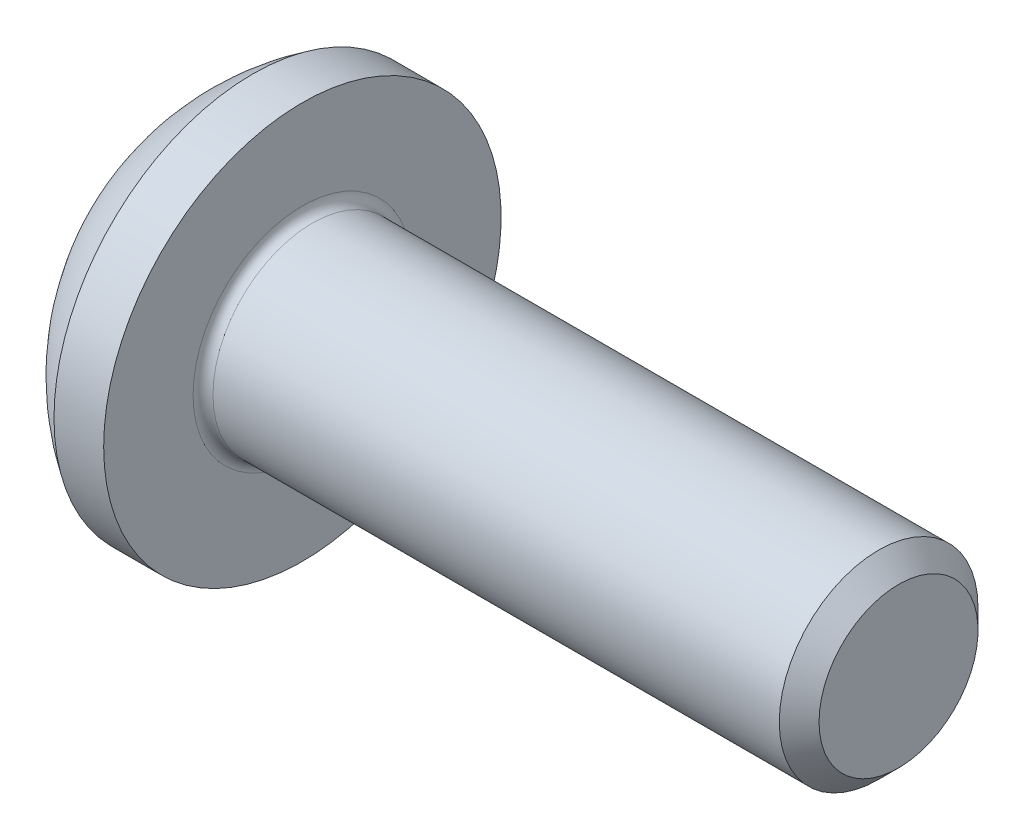
ISO-10303-21;
HEADER;
FILE_DESCRIPTION(('STEP AP214'),'2;1');
FILE_NAME('part.step','',(''),(''),'','','');
FILE_SCHEMA(('AUTOMOTIVE_DESIGN { 1 0 10303 214 1 1 1 1 }'));
ENDSEC;
DATA;
#1=APPLICATION_CONTEXT('core data for automotive mechanical design processes');
#2=APPLICATION_PROTOCOL_DEFINITION('international standard','automotive_design',2000,#1);
#3=PRODUCT_CONTEXT('',#1,'mechanical');
#4=PRODUCT('Part','Part','',(#3));
#5=PRODUCT_RELATED_PRODUCT_CATEGORY('part','',(#4));
#6=PRODUCT_DEFINITION_FORMATION('','',#4);
#7=PRODUCT_DEFINITION_CONTEXT('part definition',#1,'design');
#8=PRODUCT_DEFINITION('design','',#6,#7);
#9=PRODUCT_DEFINITION_SHAPE('','',#8);
#10=(LENGTH_UNIT() NAMED_UNIT(*) SI_UNIT(.MILLI.,.METRE.));
#11=(NAMED_UNIT(*) PLANE_ANGLE_UNIT() SI_UNIT($,.RADIAN.));
#12=(NAMED_UNIT(*) SI_UNIT($,.STERADIAN.) SOLID_ANGLE_UNIT());
#13=UNCERTAINTY_MEASURE_WITH_UNIT(LENGTH_MEASURE(1.E-05),#10,'distance_accuracy_value','');
#14=(GEOMETRIC_REPRESENTATION_CONTEXT(3) GLOBAL_UNCERTAINTY_ASSIGNED_CONTEXT((#13)) GLOBAL_UNIT_ASSIGNED_CONTEXT((#10,
#11,#12)) REPRESENTATION_CONTEXT('',''));
#15=CARTESIAN_POINT('',(0.,0.,0.));
#16=DIRECTION('',(0.,0.,1.));
#17=DIRECTION('',(1.,0.,0.));
#18=AXIS2_PLACEMENT_3D('',#15,#16,#17);
#19=CARTESIAN_POINT('',(1.2,0.,0.));
#20=DIRECTION('',(0.203954254112001,0.,-0.978980419737605));
#21=DIRECTION('',(-0.978980419737605,0.,-0.203954254112001));
#22=AXIS2_PLACEMENT_3D('',#19,#20,#21);
#23=PLANE('',#22);
#24=DIRECTION('',(-0.773791056262993,-0.612584586208203,-0.16120647005479));
#25=VECTOR('',#24,1.);
#26=CARTESIAN_POINT('',(1.2,0.,0.));
#27=LINE('',#26,#25);
#28=CARTESIAN_POINT('',(1.2,0.,0.));
#29=VERTEX_POINT('',#28);
#30=CARTESIAN_POINT('',(0.158727550068813,-0.824340689528857,-0.216931760402331));
#31=VERTEX_POINT('',#30);
#32=EDGE_CURVE('E164',#29,#31,#27,.T.);
#33=ORIENTED_EDGE('',*,*,#32,.F.);
#34=DIRECTION('',(-0.959232920372918,-0.199840191744357,-0.199840191744358));
#35=VECTOR('',#34,1.);
#36=CARTESIAN_POINT('',(1.2,0.,0.));
#37=LINE('',#36,#35);
#38=CARTESIAN_POINT('',(0.0254216507265493,-0.244703822765302,-0.244703822765302));
#39=VERTEX_POINT('',#38);
#40=EDGE_CURVE('E121',#29,#39,#37,.T.);
#41=ORIENTED_EDGE('',*,*,#40,.T.);
#42=CARTESIAN_POINT('',(2.31958856451369,0.,0.233247617607019));
#43=DIRECTION('',(0.203954254112001,0.,-0.978980419737605));
#44=DIRECTION('',(-0.978980419737605,0.,-0.203954254112001));
#45=AXIS2_PLACEMENT_3D('',#42,#43,#44);
#46=CIRCLE('',#45,2.35616624382609);
#47=EDGE_CURVE('E136',#31,#39,#46,.T.);
#48=ORIENTED_EDGE('',*,*,#47,.F.);
#49=EDGE_LOOP('',(#33,#41,#48));
#50=FACE_BOUND('',#49,.T.);
#51=ADVANCED_FACE('F41',(#50),#23,.F.);
#52=CARTESIAN_POINT('',(1.2,0.,0.));
#53=DIRECTION('',(0.203954254112001,0.,0.978980419737605));
#54=DIRECTION('',(0.978980419737605,0.,-0.203954254112001));
#55=AXIS2_PLACEMENT_3D('',#52,#53,#54);
#56=PLANE('',#55);
#57=CARTESIAN_POINT('',(2.31958856451369,0.,-0.233247617607019));
#58=DIRECTION('',(0.203954254112001,0.,0.978980419737605));
#59=DIRECTION('',(0.978980419737605,0.,-0.203954254112001));
#60=AXIS2_PLACEMENT_3D('',#57,#58,#59);
#61=CIRCLE('',#60,2.35616624382609);
#62=CARTESIAN_POINT('',(0.0254216507265493,-0.244703822765303,0.244703822765302));
#63=VERTEX_POINT('',#62);
#64=CARTESIAN_POINT('',(0.158727550068813,-0.824340689528857,0.216931760402331));
#65=VERTEX_POINT('',#64);
#66=EDGE_CURVE('E64',#63,#65,#61,.T.);
#67=ORIENTED_EDGE('',*,*,#66,.F.);
#68=DIRECTION('',(0.959232920372918,0.199840191744359,-0.199840191744358));
#69=VECTOR('',#68,1.);
#70=CARTESIAN_POINT('',(1.2,0.,0.));
#71=LINE('',#70,#69);
#72=EDGE_CURVE('E135',#63,#29,#71,.T.);
#73=ORIENTED_EDGE('',*,*,#72,.T.);
#74=DIRECTION('',(-0.773791056262993,-0.612584586208203,0.16120647005479));
#75=VECTOR('',#74,1.);
#76=CARTESIAN_POINT('',(1.2,0.,0.));
#77=LINE('',#76,#75);
#78=EDGE_CURVE('E165',#29,#65,#77,.T.);
#79=ORIENTED_EDGE('',*,*,#78,.T.);
#80=EDGE_LOOP('',(#67,#73,#79));
#81=FACE_BOUND('',#80,.T.);
#82=ADVANCED_FACE('F180',(#81),#56,.F.);
#83=CARTESIAN_POINT('',(2.36818181818182,0.,0.));
#84=DIRECTION('',(-1.,0.,0.));
#85=DIRECTION('',(0.,1.,0.));
#86=AXIS2_PLACEMENT_3D('',#83,#84,#85);
#87=SPHERICAL_SURFACE('',#86,2.36818181818182);
#88=CARTESIAN_POINT('',(1.9181139031726,0.,-0.568506840011642));
#89=DIRECTION('',(0.620702944365561,0.,0.784045824461761));
#90=DIRECTION('',(0.784045824461761,0.,-0.620702944365561));
#91=AXIS2_PLACEMENT_3D('',#88,#89,#90);
#92=CIRCLE('',#91,2.25444537940181);
#93=CARTESIAN_POINT('',(0.158727550068813,0.216931760402328,0.824340689528857));
#94=VERTEX_POINT('',#93);
#95=CARTESIAN_POINT('',(0.158727550068813,-0.216931760402334,0.824340689528856));
#96=VERTEX_POINT('',#95);
#97=EDGE_CURVE('E127',#94,#96,#92,.T.);
#98=ORIENTED_EDGE('',*,*,#97,.T.);
#99=CARTESIAN_POINT('',(2.31958856451369,0.233247617607019,0.));
#100=DIRECTION('',(0.203954254112001,-0.978980419737605,0.));
#101=DIRECTION('',(0.978980419737605,0.203954254112001,0.));
#102=AXIS2_PLACEMENT_3D('',#99,#100,#101);
#103=CIRCLE('',#102,2.35616624382609);
#104=EDGE_CURVE('E147',#96,#63,#103,.T.);
#105=ORIENTED_EDGE('',*,*,#104,.T.);
#106=ORIENTED_EDGE('',*,*,#66,.T.);
#107=CARTESIAN_POINT('',(1.9181139031726,0.568506840011642,0.));
#108=DIRECTION('',(0.620702944365561,-0.784045824461761,0.));
#109=DIRECTION('',(0.784045824461761,0.620702944365561,0.));
#110=AXIS2_PLACEMENT_3D('',#107,#108,#109);
#111=CIRCLE('',#110,2.25444537940181);
#112=EDGE_CURVE('E177',#65,#31,#111,.T.);
#113=ORIENTED_EDGE('',*,*,#112,.T.);
#114=ORIENTED_EDGE('',*,*,#47,.T.);
#115=CARTESIAN_POINT('',(0.158727550068813,-0.216931760402328,-0.824340689528857));
#116=VERTEX_POINT('',#115);
#117=EDGE_CURVE('E123',#39,#116,#103,.T.);
#118=ORIENTED_EDGE('',*,*,#117,.T.);
#119=CARTESIAN_POINT('',(1.9181139031726,0.,0.568506840011642));
#120=DIRECTION('',(0.620702944365561,0.,-0.784045824461761));
#121=DIRECTION('',(-0.784045824461761,0.,-0.620702944365561));
#122=AXIS2_PLACEMENT_3D('',#119,#120,#121);
#123=CIRCLE('',#122,2.25444537940181);
#124=CARTESIAN_POINT('',(0.158727550068812,0.216931760402334,-0.824340689528856));
#125=VERTEX_POINT('',#124);
#126=EDGE_CURVE('E115',#116,#125,#123,.T.);
#127=ORIENTED_EDGE('',*,*,#126,.T.);
#128=CARTESIAN_POINT('',(2.31958856451369,-0.233247617607019,0.));
#129=DIRECTION('',(0.203954254112001,0.978980419737605,0.));
#130=DIRECTION('',(-0.978980419737605,0.203954254112001,0.));
#131=AXIS2_PLACEMENT_3D('',#128,#129,#130);
#132=CIRCLE('',#131,2.35616624382609);
#133=CARTESIAN_POINT('',(0.0254216507265493,0.244703822765303,-0.244703822765302));
#134=VERTEX_POINT('',#133);
#135=EDGE_CURVE('E106',#125,#134,#132,.T.);
#136=ORIENTED_EDGE('',*,*,#135,.T.);
#137=CARTESIAN_POINT('',(0.158727550068813,0.824340689528857,-0.216931760402331));
#138=VERTEX_POINT('',#137);
#139=EDGE_CURVE('E155',#134,#138,#46,.T.);
#140=ORIENTED_EDGE('',*,*,#139,.T.);
#141=CARTESIAN_POINT('',(1.9181139031726,-0.568506840011642,0.));
#142=DIRECTION('',(0.620702944365561,0.784045824461761,0.));
#143=DIRECTION('',(-0.784045824461761,0.620702944365561,0.));
#144=AXIS2_PLACEMENT_3D('',#141,#142,#143);
#145=CIRCLE('',#144,2.25444537940181);
#146=CARTESIAN_POINT('',(0.158727550068813,0.824340689528857,0.216931760402331));
#147=VERTEX_POINT('',#146);
#148=EDGE_CURVE('E168',#138,#147,#145,.T.);
#149=ORIENTED_EDGE('',*,*,#148,.T.);
#150=CARTESIAN_POINT('',(0.0254216507265493,0.244703822765301,0.244703822765302));
#151=VERTEX_POINT('',#150);
#152=EDGE_CURVE('E160',#147,#151,#61,.T.);
#153=ORIENTED_EDGE('',*,*,#152,.T.);
#154=EDGE_CURVE('E56',#151,#94,#132,.T.);
#155=ORIENTED_EDGE('',*,*,#154,.T.);
#156=EDGE_LOOP('',(#98,#105,#106,#113,#114,#118,#127,#136,#140,#149,#153,#155));
#157=FACE_BOUND('',#156,.T.);
#158=CARTESIAN_POINT('',(1.1,0.,0.));
#159=DIRECTION('',(-1.,0.,0.));
#160=DIRECTION('',(0.,0.,1.));
#161=AXIS2_PLACEMENT_3D('',#158,#159,#160);
#162=CIRCLE('',#161,2.);
#163=CARTESIAN_POINT('',(1.1,0.,2.));
#164=VERTEX_POINT('',#163);
#165=EDGE_CURVE('E188',#164,#164,#162,.T.);
#166=ORIENTED_EDGE('',*,*,#165,.T.);
#167=EDGE_LOOP('',(#166));
#168=FACE_BOUND('',#167,.T.);
#169=ADVANCED_FACE('F202',(#157,#168),#87,.T.);
#170=CARTESIAN_POINT('',(-1.33175770411172,0.,0.));
#171=DIRECTION('',(-1.,0.,0.));
#172=DIRECTION('',(0.,0.,1.));
#173=AXIS2_PLACEMENT_3D('',#170,#171,#172);
#174=CYLINDRICAL_SURFACE('',#173,2.);
#175=ORIENTED_EDGE('',*,*,#165,.F.);
#176=EDGE_LOOP('',(#175));
#177=FACE_BOUND('',#176,.T.);
#178=CARTESIAN_POINT('',(1.6,0.,0.));
#179=DIRECTION('',(-1.,0.,0.));
#180=DIRECTION('',(0.,0.,1.));
#181=AXIS2_PLACEMENT_3D('',#178,#179,#180);
#182=CIRCLE('',#181,2.);
#183=CARTESIAN_POINT('',(1.6,0.,2.));
#184=VERTEX_POINT('',#183);
#185=EDGE_CURVE('E191',#184,#184,#182,.T.);
#186=ORIENTED_EDGE('',*,*,#185,.T.);
#187=EDGE_LOOP('',(#186));
#188=FACE_BOUND('',#187,.T.);
#189=ADVANCED_FACE('F205',(#177,#188),#174,.T.);
#190=CARTESIAN_POINT('',(1.6,1.1,0.));
#191=DIRECTION('',(-1.,0.,0.));
#192=DIRECTION('',(0.,0.,1.));
#193=AXIS2_PLACEMENT_3D('',#190,#191,#192);
#194=PLANE('',#193);
#195=ORIENTED_EDGE('',*,*,#185,.F.);
#196=EDGE_LOOP('',(#195));
#197=FACE_BOUND('',#196,.T.);
#198=CARTESIAN_POINT('',(1.6,0.,0.));
#199=DIRECTION('',(-1.,0.,0.));
#200=DIRECTION('',(0.,0.,1.));
#201=AXIS2_PLACEMENT_3D('',#198,#199,#200);
#202=CIRCLE('',#201,1.1);
#203=CARTESIAN_POINT('',(1.6,0.,1.1));
#204=VERTEX_POINT('',#203);
#205=EDGE_CURVE('E194',#204,#204,#202,.T.);
#206=ORIENTED_EDGE('',*,*,#205,.T.);
#207=EDGE_LOOP('',(#206));
#208=FACE_BOUND('',#207,.T.);
#209=ADVANCED_FACE('F210',(#197,#208),#194,.F.);
#210=CARTESIAN_POINT('',(1.7,0.,0.));
#211=DIRECTION('',(-1.,0.,0.));
#212=DIRECTION('',(0.,0.,1.));
#213=AXIS2_PLACEMENT_3D('',#210,#211,#212);
#214=TOROIDAL_SURFACE('',#213,1.1,0.1);
#215=ORIENTED_EDGE('',*,*,#205,.F.);
#216=EDGE_LOOP('',(#215));
#217=FACE_BOUND('',#216,.T.);
#218=CARTESIAN_POINT('',(1.7,0.,0.));
#219=DIRECTION('',(-1.,0.,0.));
#220=DIRECTION('',(0.,0.,1.));
#221=AXIS2_PLACEMENT_3D('',#218,#219,#220);
#222=CIRCLE('',#221,0.999999999999999);
#223=CARTESIAN_POINT('',(1.7,0.,0.999999999999999));
#224=VERTEX_POINT('',#223);
#225=EDGE_CURVE('E169',#224,#224,#222,.T.);
#226=ORIENTED_EDGE('',*,*,#225,.T.);
#227=EDGE_LOOP('',(#226));
#228=FACE_BOUND('',#227,.T.);
#229=ADVANCED_FACE('F216',(#217,#228),#214,.F.);
#230=CARTESIAN_POINT('',(-1.33175770411172,0.,0.));
#231=DIRECTION('',(-1.,0.,0.));
#232=DIRECTION('',(0.,0.,1.));
#233=AXIS2_PLACEMENT_3D('',#230,#231,#232);
#234=CYLINDRICAL_SURFACE('',#233,0.999999999999999);
#235=CARTESIAN_POINT('',(7.4,0.,0.));
#236=DIRECTION('',(-1.,0.,0.));
#237=DIRECTION('',(0.,0.,1.));
#238=AXIS2_PLACEMENT_3D('',#235,#236,#237);
#239=CIRCLE('',#238,0.999999999999999);
#240=CARTESIAN_POINT('',(7.4,0.,0.999999999999999));
#241=VERTEX_POINT('',#240);
#242=EDGE_CURVE('E49',#241,#241,#239,.T.);
#243=ORIENTED_EDGE('',*,*,#242,.T.);
#244=EDGE_LOOP('',(#243));
#245=FACE_BOUND('',#244,.T.);
#246=ORIENTED_EDGE('',*,*,#225,.F.);
#247=EDGE_LOOP('',(#246));
#248=FACE_BOUND('',#247,.T.);
#249=ADVANCED_FACE('F222',(#245,#248),#234,.T.);
#250=CARTESIAN_POINT('',(7.6,0.,0.));
#251=DIRECTION('',(-1.,0.,0.));
#252=DIRECTION('',(0.,0.,1.));
#253=AXIS2_PLACEMENT_3D('',#250,#251,#252);
#254=PLANE('',#253);
#255=CARTESIAN_POINT('',(7.6,0.,0.));
#256=DIRECTION('',(-1.,0.,0.));
#257=DIRECTION('',(0.,0.,1.));
#258=AXIS2_PLACEMENT_3D('',#255,#256,#257);
#259=CIRCLE('',#258,0.799999999999997);
#260=CARTESIAN_POINT('',(7.6,0.,0.799999999999997));
#261=VERTEX_POINT('',#260);
#262=EDGE_CURVE('E11',#261,#261,#259,.F.);
#263=ORIENTED_EDGE('',*,*,#262,.T.);
#264=EDGE_LOOP('',(#263));
#265=FACE_BOUND('',#264,.T.);
#266=ADVANCED_FACE('F227',(#265),#254,.F.);
#267=ORIENTED_EDGE('',*,*,#139,.F.);
#268=DIRECTION('',(0.959232920372918,-0.199840191744359,0.199840191744358));
#269=VECTOR('',#268,1.);
#270=CARTESIAN_POINT('',(1.2,0.,0.));
#271=LINE('',#270,#269);
#272=EDGE_CURVE('E104',#134,#29,#271,.T.);
#273=ORIENTED_EDGE('',*,*,#272,.T.);
#274=DIRECTION('',(-0.773791056262993,0.612584586208203,-0.16120647005479));
#275=VECTOR('',#274,1.);
#276=CARTESIAN_POINT('',(1.2,0.,0.));
#277=LINE('',#276,#275);
#278=EDGE_CURVE('E154',#29,#138,#277,.T.);
#279=ORIENTED_EDGE('',*,*,#278,.T.);
#280=EDGE_LOOP('',(#267,#273,#279));
#281=FACE_BOUND('',#280,.T.);
#282=ADVANCED_FACE('F152',(#281),#23,.F.);
#283=CARTESIAN_POINT('',(0.,0.95,-0.25));
#284=DIRECTION('',(0.620702944365561,0.784045824461761,0.));
#285=DIRECTION('',(-0.784045824461761,0.620702944365561,0.));
#286=AXIS2_PLACEMENT_3D('',#283,#284,#285);
#287=PLANE('',#286);
#288=ORIENTED_EDGE('',*,*,#278,.F.);
#289=DIRECTION('',(-0.773791056262993,0.612584586208203,0.16120647005479));
#290=VECTOR('',#289,1.);
#291=CARTESIAN_POINT('',(1.2,0.,0.));
#292=LINE('',#291,#290);
#293=EDGE_CURVE('E158',#29,#147,#292,.T.);
#294=ORIENTED_EDGE('',*,*,#293,.T.);
#295=ORIENTED_EDGE('',*,*,#148,.F.);
#296=EDGE_LOOP('',(#288,#294,#295));
#297=FACE_BOUND('',#296,.T.);
#298=ADVANCED_FACE('F167',(#297),#287,.F.);
#299=CARTESIAN_POINT('',(0.,-0.95,0.25));
#300=DIRECTION('',(0.620702944365561,-0.784045824461761,0.));
#301=DIRECTION('',(0.784045824461761,0.620702944365561,0.));
#302=AXIS2_PLACEMENT_3D('',#299,#300,#301);
#303=PLANE('',#302);
#304=ORIENTED_EDGE('',*,*,#78,.F.);
#305=ORIENTED_EDGE('',*,*,#32,.T.);
#306=ORIENTED_EDGE('',*,*,#112,.F.);
#307=EDGE_LOOP('',(#304,#305,#306));
#308=FACE_BOUND('',#307,.T.);
#309=ADVANCED_FACE('F176',(#308),#303,.F.);
#310=ORIENTED_EDGE('',*,*,#293,.F.);
#311=DIRECTION('',(-0.959232920372918,0.199840191744357,0.199840191744358));
#312=VECTOR('',#311,1.);
#313=CARTESIAN_POINT('',(1.2,0.,0.));
#314=LINE('',#313,#312);
#315=EDGE_CURVE('E129',#29,#151,#314,.T.);
#316=ORIENTED_EDGE('',*,*,#315,.T.);
#317=ORIENTED_EDGE('',*,*,#152,.F.);
#318=EDGE_LOOP('',(#310,#316,#317));
#319=FACE_BOUND('',#318,.T.);
#320=ADVANCED_FACE('F159',(#319),#56,.F.);
#321=CARTESIAN_POINT('',(1.2,0.,0.));
#322=DIRECTION('',(0.203954254112001,-0.978980419737605,0.));
#323=DIRECTION('',(-0.978980419737605,-0.203954254112001,0.));
#324=AXIS2_PLACEMENT_3D('',#321,#322,#323);
#325=PLANE('',#324);
#326=DIRECTION('',(-0.773791056262993,-0.161206470054793,0.612584586208202));
#327=VECTOR('',#326,1.);
#328=CARTESIAN_POINT('',(1.2,0.,0.));
#329=LINE('',#328,#327);
#330=EDGE_CURVE('E118',#29,#96,#329,.T.);
#331=ORIENTED_EDGE('',*,*,#330,.F.);
#332=ORIENTED_EDGE('',*,*,#72,.F.);
#333=ORIENTED_EDGE('',*,*,#104,.F.);
#334=EDGE_LOOP('',(#331,#332,#333));
#335=FACE_BOUND('',#334,.T.);
#336=ADVANCED_FACE('F145',(#335),#325,.F.);
#337=CARTESIAN_POINT('',(1.2,0.,0.));
#338=DIRECTION('',(0.203954254112001,0.978980419737605,0.));
#339=DIRECTION('',(0.978980419737605,-0.203954254112001,0.));
#340=AXIS2_PLACEMENT_3D('',#337,#338,#339);
#341=PLANE('',#340);
#342=ORIENTED_EDGE('',*,*,#315,.F.);
#343=DIRECTION('',(-0.773791056262993,0.161206470054788,0.612584586208203));
#344=VECTOR('',#343,1.);
#345=CARTESIAN_POINT('',(1.2,0.,0.));
#346=LINE('',#345,#344);
#347=EDGE_CURVE('E109',#29,#94,#346,.T.);
#348=ORIENTED_EDGE('',*,*,#347,.T.);
#349=ORIENTED_EDGE('',*,*,#154,.F.);
#350=EDGE_LOOP('',(#342,#348,#349));
#351=FACE_BOUND('',#350,.T.);
#352=ADVANCED_FACE('F131',(#351),#341,.F.);
#353=CARTESIAN_POINT('',(0.,-0.250000000000004,0.949999999999999));
#354=DIRECTION('',(0.620702944365561,0.,0.784045824461761));
#355=DIRECTION('',(-0.784045824461761,0.,0.620702944365561));
#356=AXIS2_PLACEMENT_3D('',#353,#354,#355);
#357=PLANE('',#356);
#358=ORIENTED_EDGE('',*,*,#347,.F.);
#359=ORIENTED_EDGE('',*,*,#330,.T.);
#360=ORIENTED_EDGE('',*,*,#97,.F.);
#361=EDGE_LOOP('',(#358,#359,#360));
#362=FACE_BOUND('',#361,.T.);
#363=ADVANCED_FACE('F141',(#362),#357,.F.);
#364=ORIENTED_EDGE('',*,*,#40,.F.);
#365=DIRECTION('',(-0.773791056262993,-0.161206470054788,-0.612584586208203));
#366=VECTOR('',#365,1.);
#367=CARTESIAN_POINT('',(1.2,0.,0.));
#368=LINE('',#367,#366);
#369=EDGE_CURVE('E112',#29,#116,#368,.T.);
#370=ORIENTED_EDGE('',*,*,#369,.T.);
#371=ORIENTED_EDGE('',*,*,#117,.F.);
#372=EDGE_LOOP('',(#364,#370,#371));
#373=FACE_BOUND('',#372,.T.);
#374=ADVANCED_FACE('F122',(#373),#325,.F.);
#375=CARTESIAN_POINT('',(0.,0.250000000000004,-0.949999999999999));
#376=DIRECTION('',(0.620702944365561,0.,-0.784045824461761));
#377=DIRECTION('',(0.784045824461761,0.,0.620702944365561));
#378=AXIS2_PLACEMENT_3D('',#375,#376,#377);
#379=PLANE('',#378);
#380=ORIENTED_EDGE('',*,*,#369,.F.);
#381=DIRECTION('',(-0.773791056262993,0.161206470054793,-0.612584586208202));
#382=VECTOR('',#381,1.);
#383=CARTESIAN_POINT('',(1.2,0.,0.));
#384=LINE('',#383,#382);
#385=EDGE_CURVE('E100',#29,#125,#384,.T.);
#386=ORIENTED_EDGE('',*,*,#385,.T.);
#387=ORIENTED_EDGE('',*,*,#126,.F.);
#388=EDGE_LOOP('',(#380,#386,#387));
#389=FACE_BOUND('',#388,.T.);
#390=ADVANCED_FACE('F114',(#389),#379,.F.);
#391=ORIENTED_EDGE('',*,*,#385,.F.);
#392=ORIENTED_EDGE('',*,*,#272,.F.);
#393=ORIENTED_EDGE('',*,*,#135,.F.);
#394=EDGE_LOOP('',(#391,#392,#393));
#395=FACE_BOUND('',#394,.T.);
#396=ADVANCED_FACE('F102',(#395),#341,.F.);
#397=CARTESIAN_POINT('',(7.4,0.,0.));
#398=DIRECTION('',(-1.,0.,0.));
#399=DIRECTION('',(0.,0.,1.));
#400=AXIS2_PLACEMENT_3D('',#397,#398,#399);
#401=CONICAL_SURFACE('',#400,0.999999999999999,0.785398163397448);
#402=ORIENTED_EDGE('',*,*,#262,.F.);
#403=EDGE_LOOP('',(#402));
#404=FACE_BOUND('',#403,.T.);
#405=ORIENTED_EDGE('',*,*,#242,.F.);
#406=EDGE_LOOP('',(#405));
#407=FACE_BOUND('',#406,.T.);
#408=ADVANCED_FACE('F43',(#404,#407),#401,.T.);
#409=CLOSED_SHELL('',(#51,#82,#169,#189,#209,#229,#249,#266,#282,#298,#309,#320,#336,#352,#363,
#374,#390,#396,#408));
#410=MANIFOLD_SOLID_BREP('B2',#409);
#411=ADVANCED_BREP_SHAPE_REPRESENTATION('',(#18,#410),#14);
#412=SHAPE_DEFINITION_REPRESENTATION(#9,#411);
ENDSEC;
END-ISO-10303-21;
